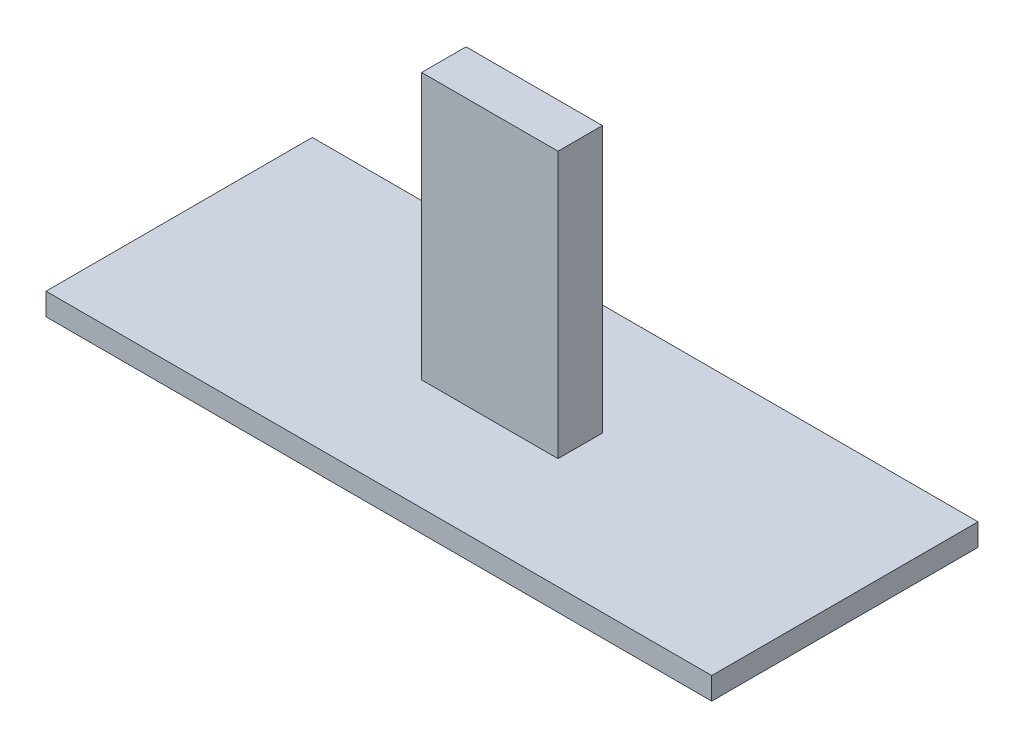
ISO-10303-21;
HEADER;
FILE_DESCRIPTION(('STEP AP214'),'2;1');
FILE_NAME('part.step','',(''),(''),'','','');
FILE_SCHEMA(('AUTOMOTIVE_DESIGN { 1 0 10303 214 1 1 1 1 }'));
ENDSEC;
DATA;
#1=APPLICATION_CONTEXT('core data for automotive mechanical design processes');
#2=APPLICATION_PROTOCOL_DEFINITION('international standard','automotive_design',2000,#1);
#3=PRODUCT_CONTEXT('',#1,'mechanical');
#4=PRODUCT('Part','Part','',(#3));
#5=PRODUCT_RELATED_PRODUCT_CATEGORY('part','',(#4));
#6=PRODUCT_DEFINITION_FORMATION('','',#4);
#7=PRODUCT_DEFINITION_CONTEXT('part definition',#1,'design');
#8=PRODUCT_DEFINITION('design','',#6,#7);
#9=PRODUCT_DEFINITION_SHAPE('','',#8);
#10=(LENGTH_UNIT() NAMED_UNIT(*) SI_UNIT(.MILLI.,.METRE.));
#11=(NAMED_UNIT(*) PLANE_ANGLE_UNIT() SI_UNIT($,.RADIAN.));
#12=(NAMED_UNIT(*) SI_UNIT($,.STERADIAN.) SOLID_ANGLE_UNIT());
#13=UNCERTAINTY_MEASURE_WITH_UNIT(LENGTH_MEASURE(1.E-05),#10,'distance_accuracy_value','');
#14=(GEOMETRIC_REPRESENTATION_CONTEXT(3) GLOBAL_UNCERTAINTY_ASSIGNED_CONTEXT((#13)) GLOBAL_UNIT_ASSIGNED_CONTEXT((#10,
#11,#12)) REPRESENTATION_CONTEXT('',''));
#15=CARTESIAN_POINT('',(0.,0.,0.));
#16=DIRECTION('',(0.,0.,1.));
#17=DIRECTION('',(1.,0.,0.));
#18=AXIS2_PLACEMENT_3D('',#15,#16,#17);
#19=CARTESIAN_POINT('',(0.,5.,0.));
#20=DIRECTION('',(0.,1.,0.));
#21=DIRECTION('',(0.,0.,1.));
#22=AXIS2_PLACEMENT_3D('',#19,#20,#21);
#23=PLANE('',#22);
#24=DIRECTION('',(1.,0.,0.));
#25=VECTOR('',#24,1.);
#26=CARTESIAN_POINT('',(-118.668678377881,5.,0.));
#27=LINE('',#26,#25);
#28=CARTESIAN_POINT('',(-118.668678377881,5.,0.));
#29=VERTEX_POINT('',#28);
#30=CARTESIAN_POINT('',(31.3313216221193,5.,0.));
#31=VERTEX_POINT('',#30);
#32=EDGE_CURVE('E141',#29,#31,#27,.T.);
#33=ORIENTED_EDGE('',*,*,#32,.T.);
#34=DIRECTION('',(0.,0.,-1.));
#35=VECTOR('',#34,1.);
#36=CARTESIAN_POINT('',(31.3313216221193,5.,0.));
#37=LINE('',#36,#35);
#38=CARTESIAN_POINT('',(31.3313216221193,5.,-60.));
#39=VERTEX_POINT('',#38);
#40=EDGE_CURVE('E86',#31,#39,#37,.T.);
#41=ORIENTED_EDGE('',*,*,#40,.T.);
#42=DIRECTION('',(-1.,0.,0.));
#43=VECTOR('',#42,1.);
#44=CARTESIAN_POINT('',(-118.668678377881,5.,-60.));
#45=LINE('',#44,#43);
#46=CARTESIAN_POINT('',(-118.668678377881,5.,-60.));
#47=VERTEX_POINT('',#46);
#48=EDGE_CURVE('E144',#39,#47,#45,.T.);
#49=ORIENTED_EDGE('',*,*,#48,.T.);
#50=DIRECTION('',(0.,0.,1.));
#51=VECTOR('',#50,1.);
#52=CARTESIAN_POINT('',(-118.668678377881,5.,0.));
#53=LINE('',#52,#51);
#54=EDGE_CURVE('E58',#47,#29,#53,.T.);
#55=ORIENTED_EDGE('',*,*,#54,.T.);
#56=EDGE_LOOP('',(#33,#41,#49,#55));
#57=FACE_BOUND('',#56,.T.);
#58=DIRECTION('',(0.,0.,1.));
#59=VECTOR('',#58,1.);
#60=CARTESIAN_POINT('',(-59.0306648360578,5.,-25.));
#61=LINE('',#60,#59);
#62=CARTESIAN_POINT('',(-59.0306648360578,5.,-35.));
#63=VERTEX_POINT('',#62);
#64=CARTESIAN_POINT('',(-59.0306648360578,5.,-25.));
#65=VERTEX_POINT('',#64);
#66=EDGE_CURVE('E264',#63,#65,#61,.T.);
#67=ORIENTED_EDGE('',*,*,#66,.F.);
#68=DIRECTION('',(-1.,0.,0.));
#69=VECTOR('',#68,1.);
#70=CARTESIAN_POINT('',(-59.0306648360578,5.,-35.));
#71=LINE('',#70,#69);
#72=CARTESIAN_POINT('',(-28.3066919197036,5.,-35.));
#73=VERTEX_POINT('',#72);
#74=EDGE_CURVE('E131',#73,#63,#71,.T.);
#75=ORIENTED_EDGE('',*,*,#74,.F.);
#76=DIRECTION('',(0.,0.,-1.));
#77=VECTOR('',#76,1.);
#78=CARTESIAN_POINT('',(-28.3066919197036,5.,-25.));
#79=LINE('',#78,#77);
#80=CARTESIAN_POINT('',(-28.3066919197036,5.,-25.));
#81=VERTEX_POINT('',#80);
#82=EDGE_CURVE('E127',#81,#73,#79,.T.);
#83=ORIENTED_EDGE('',*,*,#82,.F.);
#84=DIRECTION('',(1.,0.,0.));
#85=VECTOR('',#84,1.);
#86=CARTESIAN_POINT('',(-59.0306648360578,5.,-25.));
#87=LINE('',#86,#85);
#88=EDGE_CURVE('E261',#65,#81,#87,.T.);
#89=ORIENTED_EDGE('',*,*,#88,.F.);
#90=EDGE_LOOP('',(#67,#75,#83,#89));
#91=FACE_BOUND('',#90,.T.);
#92=ADVANCED_FACE('F34',(#57,#91),#23,.T.);
#93=CARTESIAN_POINT('',(-118.668678377881,5.,0.));
#94=DIRECTION('',(0.,0.,-1.));
#95=DIRECTION('',(-1.,0.,0.));
#96=AXIS2_PLACEMENT_3D('',#93,#94,#95);
#97=PLANE('',#96);
#98=DIRECTION('',(1.,0.,0.));
#99=VECTOR('',#98,1.);
#100=CARTESIAN_POINT('',(-118.668678377881,0.,0.));
#101=LINE('',#100,#99);
#102=CARTESIAN_POINT('',(-118.668678377881,0.,0.));
#103=VERTEX_POINT('',#102);
#104=CARTESIAN_POINT('',(31.3313216221193,0.,0.));
#105=VERTEX_POINT('',#104);
#106=EDGE_CURVE('E133',#103,#105,#101,.T.);
#107=ORIENTED_EDGE('',*,*,#106,.T.);
#108=DIRECTION('',(0.,-1.,0.));
#109=VECTOR('',#108,1.);
#110=CARTESIAN_POINT('',(31.3313216221193,5.,0.));
#111=LINE('',#110,#109);
#112=EDGE_CURVE('E11',#31,#105,#111,.T.);
#113=ORIENTED_EDGE('',*,*,#112,.F.);
#114=ORIENTED_EDGE('',*,*,#32,.F.);
#115=DIRECTION('',(0.,-1.,0.));
#116=VECTOR('',#115,1.);
#117=CARTESIAN_POINT('',(-118.668678377881,5.,0.));
#118=LINE('',#117,#116);
#119=EDGE_CURVE('E146',#29,#103,#118,.T.);
#120=ORIENTED_EDGE('',*,*,#119,.T.);
#121=EDGE_LOOP('',(#107,#113,#114,#120));
#122=FACE_BOUND('',#121,.T.);
#123=ADVANCED_FACE('F36',(#122),#97,.F.);
#124=CARTESIAN_POINT('',(31.3313216221193,5.,0.));
#125=DIRECTION('',(-1.,0.,0.));
#126=DIRECTION('',(0.,0.,1.));
#127=AXIS2_PLACEMENT_3D('',#124,#125,#126);
#128=PLANE('',#127);
#129=DIRECTION('',(0.,0.,-1.));
#130=VECTOR('',#129,1.);
#131=CARTESIAN_POINT('',(31.3313216221193,0.,0.));
#132=LINE('',#131,#130);
#133=CARTESIAN_POINT('',(31.3313216221193,0.,-60.));
#134=VERTEX_POINT('',#133);
#135=EDGE_CURVE('E136',#105,#134,#132,.T.);
#136=ORIENTED_EDGE('',*,*,#135,.T.);
#137=DIRECTION('',(0.,-1.,0.));
#138=VECTOR('',#137,1.);
#139=CARTESIAN_POINT('',(31.3313216221193,5.,-60.));
#140=LINE('',#139,#138);
#141=EDGE_CURVE('E42',#39,#134,#140,.T.);
#142=ORIENTED_EDGE('',*,*,#141,.F.);
#143=ORIENTED_EDGE('',*,*,#40,.F.);
#144=ORIENTED_EDGE('',*,*,#112,.T.);
#145=EDGE_LOOP('',(#136,#142,#143,#144));
#146=FACE_BOUND('',#145,.T.);
#147=ADVANCED_FACE('F174',(#146),#128,.F.);
#148=CARTESIAN_POINT('',(-118.668678377881,5.,-60.));
#149=DIRECTION('',(0.,0.,1.));
#150=DIRECTION('',(1.,0.,0.));
#151=AXIS2_PLACEMENT_3D('',#148,#149,#150);
#152=PLANE('',#151);
#153=DIRECTION('',(-1.,0.,0.));
#154=VECTOR('',#153,1.);
#155=CARTESIAN_POINT('',(-118.668678377881,0.,-60.));
#156=LINE('',#155,#154);
#157=CARTESIAN_POINT('',(-118.668678377881,0.,-60.));
#158=VERTEX_POINT('',#157);
#159=EDGE_CURVE('E149',#134,#158,#156,.T.);
#160=ORIENTED_EDGE('',*,*,#159,.T.);
#161=DIRECTION('',(0.,-1.,0.));
#162=VECTOR('',#161,1.);
#163=CARTESIAN_POINT('',(-118.668678377881,5.,-60.));
#164=LINE('',#163,#162);
#165=EDGE_CURVE('E153',#47,#158,#164,.T.);
#166=ORIENTED_EDGE('',*,*,#165,.F.);
#167=ORIENTED_EDGE('',*,*,#48,.F.);
#168=ORIENTED_EDGE('',*,*,#141,.T.);
#169=EDGE_LOOP('',(#160,#166,#167,#168));
#170=FACE_BOUND('',#169,.T.);
#171=ADVANCED_FACE('F158',(#170),#152,.F.);
#172=CARTESIAN_POINT('',(-118.668678377881,5.,0.));
#173=DIRECTION('',(1.,0.,0.));
#174=DIRECTION('',(0.,0.,-1.));
#175=AXIS2_PLACEMENT_3D('',#172,#173,#174);
#176=PLANE('',#175);
#177=DIRECTION('',(0.,0.,1.));
#178=VECTOR('',#177,1.);
#179=CARTESIAN_POINT('',(-118.668678377881,0.,0.));
#180=LINE('',#179,#178);
#181=EDGE_CURVE('E79',#158,#103,#180,.T.);
#182=ORIENTED_EDGE('',*,*,#181,.T.);
#183=ORIENTED_EDGE('',*,*,#119,.F.);
#184=ORIENTED_EDGE('',*,*,#54,.F.);
#185=ORIENTED_EDGE('',*,*,#165,.T.);
#186=EDGE_LOOP('',(#182,#183,#184,#185));
#187=FACE_BOUND('',#186,.T.);
#188=ADVANCED_FACE('F166',(#187),#176,.F.);
#189=CARTESIAN_POINT('',(0.,0.,0.));
#190=DIRECTION('',(0.,1.,0.));
#191=DIRECTION('',(0.,0.,1.));
#192=AXIS2_PLACEMENT_3D('',#189,#190,#191);
#193=PLANE('',#192);
#194=ORIENTED_EDGE('',*,*,#106,.F.);
#195=ORIENTED_EDGE('',*,*,#181,.F.);
#196=ORIENTED_EDGE('',*,*,#159,.F.);
#197=ORIENTED_EDGE('',*,*,#135,.F.);
#198=EDGE_LOOP('',(#194,#195,#196,#197));
#199=FACE_BOUND('',#198,.T.);
#200=ADVANCED_FACE('F162',(#199),#193,.F.);
#201=CARTESIAN_POINT('',(-59.0306648360578,65.,-35.));
#202=DIRECTION('',(0.,0.,1.));
#203=DIRECTION('',(1.,0.,0.));
#204=AXIS2_PLACEMENT_3D('',#201,#202,#203);
#205=PLANE('',#204);
#206=ORIENTED_EDGE('',*,*,#74,.T.);
#207=DIRECTION('',(0.,-1.,0.));
#208=VECTOR('',#207,1.);
#209=CARTESIAN_POINT('',(-59.0306648360578,65.,-35.));
#210=LINE('',#209,#208);
#211=CARTESIAN_POINT('',(-59.0306648360578,65.,-35.));
#212=VERTEX_POINT('',#211);
#213=EDGE_CURVE('E112',#212,#63,#210,.T.);
#214=ORIENTED_EDGE('',*,*,#213,.F.);
#215=DIRECTION('',(-1.,0.,0.));
#216=VECTOR('',#215,1.);
#217=CARTESIAN_POINT('',(-59.0306648360578,65.,-35.));
#218=LINE('',#217,#216);
#219=CARTESIAN_POINT('',(-28.3066919197036,65.,-35.));
#220=VERTEX_POINT('',#219);
#221=EDGE_CURVE('E119',#220,#212,#218,.T.);
#222=ORIENTED_EDGE('',*,*,#221,.F.);
#223=DIRECTION('',(0.,-1.,0.));
#224=VECTOR('',#223,1.);
#225=CARTESIAN_POINT('',(-28.3066919197036,65.,-35.));
#226=LINE('',#225,#224);
#227=EDGE_CURVE('E259',#220,#73,#226,.T.);
#228=ORIENTED_EDGE('',*,*,#227,.T.);
#229=EDGE_LOOP('',(#206,#214,#222,#228));
#230=FACE_BOUND('',#229,.T.);
#231=ADVANCED_FACE('F129',(#230),#205,.F.);
#232=CARTESIAN_POINT('',(-59.0306648360578,65.,-25.));
#233=DIRECTION('',(1.,0.,0.));
#234=DIRECTION('',(0.,0.,-1.));
#235=AXIS2_PLACEMENT_3D('',#232,#233,#234);
#236=PLANE('',#235);
#237=ORIENTED_EDGE('',*,*,#66,.T.);
#238=DIRECTION('',(0.,-1.,0.));
#239=VECTOR('',#238,1.);
#240=CARTESIAN_POINT('',(-59.0306648360578,65.,-25.));
#241=LINE('',#240,#239);
#242=CARTESIAN_POINT('',(-59.0306648360578,65.,-25.));
#243=VERTEX_POINT('',#242);
#244=EDGE_CURVE('E115',#243,#65,#241,.T.);
#245=ORIENTED_EDGE('',*,*,#244,.F.);
#246=DIRECTION('',(0.,0.,1.));
#247=VECTOR('',#246,1.);
#248=CARTESIAN_POINT('',(-59.0306648360578,65.,-25.));
#249=LINE('',#248,#247);
#250=EDGE_CURVE('E108',#212,#243,#249,.T.);
#251=ORIENTED_EDGE('',*,*,#250,.F.);
#252=ORIENTED_EDGE('',*,*,#213,.T.);
#253=EDGE_LOOP('',(#237,#245,#251,#252));
#254=FACE_BOUND('',#253,.T.);
#255=ADVANCED_FACE('F110',(#254),#236,.F.);
#256=CARTESIAN_POINT('',(-59.0306648360578,65.,-25.));
#257=DIRECTION('',(0.,0.,-1.));
#258=DIRECTION('',(-1.,0.,0.));
#259=AXIS2_PLACEMENT_3D('',#256,#257,#258);
#260=PLANE('',#259);
#261=ORIENTED_EDGE('',*,*,#88,.T.);
#262=DIRECTION('',(0.,-1.,0.));
#263=VECTOR('',#262,1.);
#264=CARTESIAN_POINT('',(-28.3066919197036,65.,-25.));
#265=LINE('',#264,#263);
#266=CARTESIAN_POINT('',(-28.3066919197036,65.,-25.));
#267=VERTEX_POINT('',#266);
#268=EDGE_CURVE('E49',#267,#81,#265,.T.);
#269=ORIENTED_EDGE('',*,*,#268,.F.);
#270=DIRECTION('',(1.,0.,0.));
#271=VECTOR('',#270,1.);
#272=CARTESIAN_POINT('',(-59.0306648360578,65.,-25.));
#273=LINE('',#272,#271);
#274=EDGE_CURVE('E118',#243,#267,#273,.T.);
#275=ORIENTED_EDGE('',*,*,#274,.F.);
#276=ORIENTED_EDGE('',*,*,#244,.T.);
#277=EDGE_LOOP('',(#261,#269,#275,#276));
#278=FACE_BOUND('',#277,.T.);
#279=ADVANCED_FACE('F187',(#278),#260,.F.);
#280=CARTESIAN_POINT('',(-28.3066919197036,65.,-25.));
#281=DIRECTION('',(-1.,0.,0.));
#282=DIRECTION('',(0.,0.,1.));
#283=AXIS2_PLACEMENT_3D('',#280,#281,#282);
#284=PLANE('',#283);
#285=ORIENTED_EDGE('',*,*,#82,.T.);
#286=ORIENTED_EDGE('',*,*,#227,.F.);
#287=DIRECTION('',(0.,0.,-1.));
#288=VECTOR('',#287,1.);
#289=CARTESIAN_POINT('',(-28.3066919197036,65.,-25.));
#290=LINE('',#289,#288);
#291=EDGE_CURVE('E123',#267,#220,#290,.T.);
#292=ORIENTED_EDGE('',*,*,#291,.F.);
#293=ORIENTED_EDGE('',*,*,#268,.T.);
#294=EDGE_LOOP('',(#285,#286,#292,#293));
#295=FACE_BOUND('',#294,.T.);
#296=ADVANCED_FACE('F190',(#295),#284,.F.);
#297=CARTESIAN_POINT('',(0.,65.,0.));
#298=DIRECTION('',(0.,1.,0.));
#299=DIRECTION('',(0.,0.,1.));
#300=AXIS2_PLACEMENT_3D('',#297,#298,#299);
#301=PLANE('',#300);
#302=ORIENTED_EDGE('',*,*,#221,.T.);
#303=ORIENTED_EDGE('',*,*,#250,.T.);
#304=ORIENTED_EDGE('',*,*,#274,.T.);
#305=ORIENTED_EDGE('',*,*,#291,.T.);
#306=EDGE_LOOP('',(#302,#303,#304,#305));
#307=FACE_BOUND('',#306,.T.);
#308=ADVANCED_FACE('F122',(#307),#301,.T.);
#309=CLOSED_SHELL('',(#92,#123,#147,#171,#188,#200,#231,#255,#279,#296,#308));
#310=MANIFOLD_SOLID_BREP('B2',#309);
#311=ADVANCED_BREP_SHAPE_REPRESENTATION('',(#18,#310),#14);
#312=SHAPE_DEFINITION_REPRESENTATION(#9,#311);
ENDSEC;
END-ISO-10303-21;
